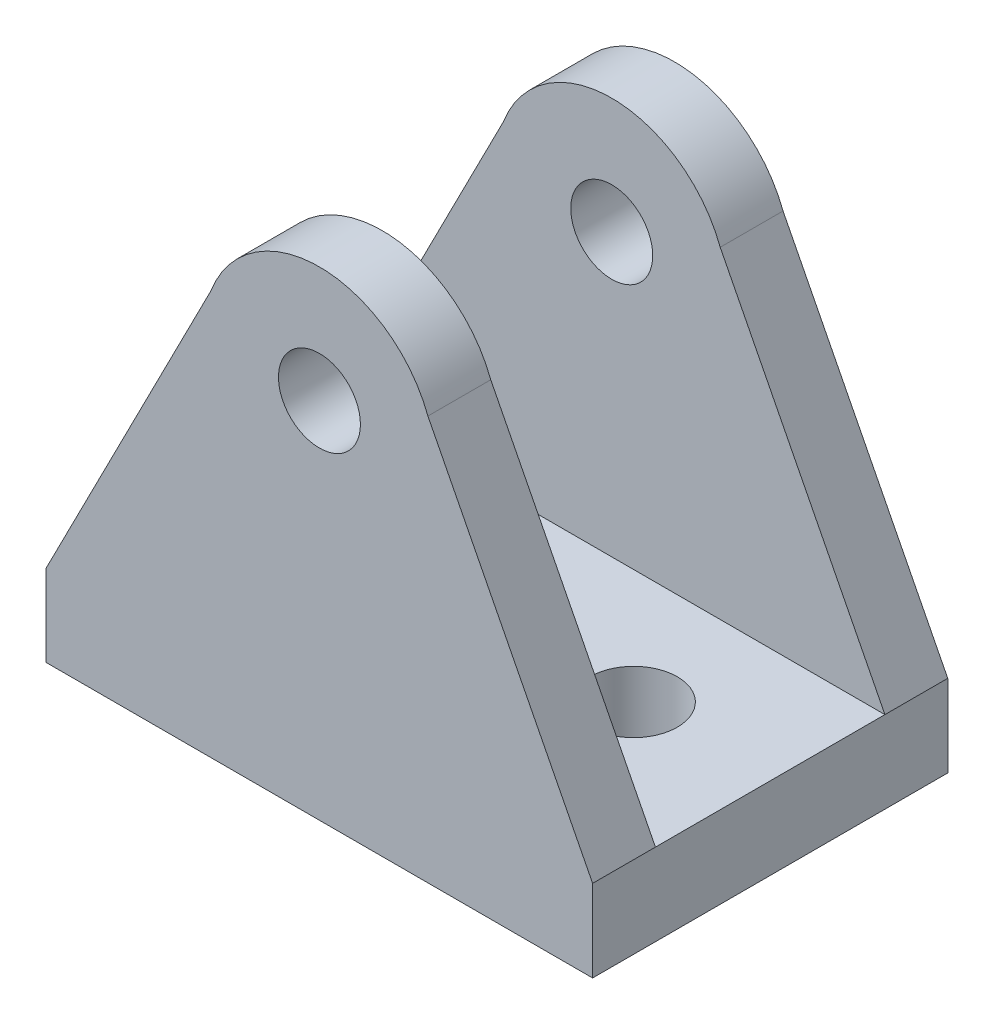
ISO-10303-21;
HEADER;
FILE_DESCRIPTION(('STEP AP214'),'2;1');
FILE_NAME('part.step','',(''),(''),'','','');
FILE_SCHEMA(('AUTOMOTIVE_DESIGN { 1 0 10303 214 1 1 1 1 }'));
ENDSEC;
DATA;
#1=APPLICATION_CONTEXT('core data for automotive mechanical design processes');
#2=APPLICATION_PROTOCOL_DEFINITION('international standard','automotive_design',2000,#1);
#3=PRODUCT_CONTEXT('',#1,'mechanical');
#4=PRODUCT('Part','Part','',(#3));
#5=PRODUCT_RELATED_PRODUCT_CATEGORY('part','',(#4));
#6=PRODUCT_DEFINITION_FORMATION('','',#4);
#7=PRODUCT_DEFINITION_CONTEXT('part definition',#1,'design');
#8=PRODUCT_DEFINITION('design','',#6,#7);
#9=PRODUCT_DEFINITION_SHAPE('','',#8);
#10=(LENGTH_UNIT() NAMED_UNIT(*) SI_UNIT(.MILLI.,.METRE.));
#11=(NAMED_UNIT(*) PLANE_ANGLE_UNIT() SI_UNIT($,.RADIAN.));
#12=(NAMED_UNIT(*) SI_UNIT($,.STERADIAN.) SOLID_ANGLE_UNIT());
#13=UNCERTAINTY_MEASURE_WITH_UNIT(LENGTH_MEASURE(1.E-05),#10,'distance_accuracy_value','');
#14=(GEOMETRIC_REPRESENTATION_CONTEXT(3) GLOBAL_UNCERTAINTY_ASSIGNED_CONTEXT((#13)) GLOBAL_UNIT_ASSIGNED_CONTEXT((#10,
#11,#12)) REPRESENTATION_CONTEXT('',''));
#15=CARTESIAN_POINT('',(0.,0.,0.));
#16=DIRECTION('',(0.,0.,1.));
#17=DIRECTION('',(1.,0.,0.));
#18=AXIS2_PLACEMENT_3D('',#15,#16,#17);
#19=CARTESIAN_POINT('',(0.,3.,0.));
#20=DIRECTION('',(0.,-1.,0.));
#21=DIRECTION('',(0.,0.,-1.));
#22=AXIS2_PLACEMENT_3D('',#19,#20,#21);
#23=PLANE('',#22);
#24=CARTESIAN_POINT('',(40.3430756374337,3.,-47.7194258680598));
#25=DIRECTION('',(0.,-1.,0.));
#26=DIRECTION('',(0.,0.,-1.));
#27=AXIS2_PLACEMENT_3D('',#24,#25,#26);
#28=CIRCLE('',#27,1.59999999999981);
#29=CARTESIAN_POINT('',(40.3430756374337,3.,-49.3194258680596));
#30=VERTEX_POINT('',#29);
#31=EDGE_CURVE('E285',#30,#30,#28,.T.);
#32=ORIENTED_EDGE('',*,*,#31,.T.);
#33=EDGE_LOOP('',(#32));
#34=FACE_BOUND('',#33,.T.);
#35=CARTESIAN_POINT('',(30.3430756374334,3.,-47.7194258680598));
#36=DIRECTION('',(0.,-1.,0.));
#37=DIRECTION('',(0.,0.,-1.));
#38=AXIS2_PLACEMENT_3D('',#35,#36,#37);
#39=CIRCLE('',#38,1.59999999999981);
#40=CARTESIAN_POINT('',(30.3430756374334,3.,-49.3194258680596));
#41=VERTEX_POINT('',#40);
#42=EDGE_CURVE('E274',#41,#41,#39,.T.);
#43=ORIENTED_EDGE('',*,*,#42,.T.);
#44=EDGE_LOOP('',(#43));
#45=FACE_BOUND('',#44,.T.);
#46=DIRECTION('',(1.,0.,0.));
#47=VECTOR('',#46,1.);
#48=CARTESIAN_POINT('',(0.,3.,-51.9194258680596));
#49=LINE('',#48,#47);
#50=CARTESIAN_POINT('',(25.3430756374335,3.,-51.9194258680596));
#51=VERTEX_POINT('',#50);
#52=CARTESIAN_POINT('',(45.3430756374336,3.,-51.9194258680596));
#53=VERTEX_POINT('',#52);
#54=EDGE_CURVE('E64',#51,#53,#49,.T.);
#55=ORIENTED_EDGE('',*,*,#54,.F.);
#56=DIRECTION('',(0.,0.,-1.));
#57=VECTOR('',#56,1.);
#58=CARTESIAN_POINT('',(25.3430756374335,3.,-51.2194258680596));
#59=LINE('',#58,#57);
#60=CARTESIAN_POINT('',(25.3430756374335,3.,-43.5194258680597));
#61=VERTEX_POINT('',#60);
#62=EDGE_CURVE('E146',#51,#61,#59,.F.);
#63=ORIENTED_EDGE('',*,*,#62,.T.);
#64=DIRECTION('',(1.,0.,0.));
#65=VECTOR('',#64,1.);
#66=CARTESIAN_POINT('',(0.,3.,-43.5194258680597));
#67=LINE('',#66,#65);
#68=CARTESIAN_POINT('',(45.3430756374336,3.,-43.5194258680597));
#69=VERTEX_POINT('',#68);
#70=EDGE_CURVE('E50',#69,#61,#67,.F.);
#71=ORIENTED_EDGE('',*,*,#70,.F.);
#72=DIRECTION('',(0.,0.,1.));
#73=VECTOR('',#72,1.);
#74=CARTESIAN_POINT('',(45.3430756374336,3.,-51.2194258680596));
#75=LINE('',#74,#73);
#76=EDGE_CURVE('E242',#69,#53,#75,.F.);
#77=ORIENTED_EDGE('',*,*,#76,.T.);
#78=EDGE_LOOP('',(#55,#63,#71,#77));
#79=FACE_BOUND('',#78,.T.);
#80=ADVANCED_FACE('F47',(#34,#45,#79),#23,.F.);
#81=CARTESIAN_POINT('',(45.3430756374336,3.,-51.2194258680596));
#82=DIRECTION('',(-1.,0.,0.));
#83=DIRECTION('',(0.,0.,1.));
#84=AXIS2_PLACEMENT_3D('',#81,#82,#83);
#85=PLANE('',#84);
#86=ORIENTED_EDGE('',*,*,#76,.F.);
#87=DIRECTION('',(0.,0.,-1.));
#88=VECTOR('',#87,1.);
#89=CARTESIAN_POINT('',(45.3430756374336,3.,-41.2194258680597));
#90=LINE('',#89,#88);
#91=CARTESIAN_POINT('',(45.3430756374336,3.,-41.2194258680597));
#92=VERTEX_POINT('',#91);
#93=EDGE_CURVE('E183',#92,#69,#90,.T.);
#94=ORIENTED_EDGE('',*,*,#93,.F.);
#95=DIRECTION('',(0.,1.,0.));
#96=VECTOR('',#95,1.);
#97=CARTESIAN_POINT('',(45.3430756374336,3.,-41.2194258680597));
#98=LINE('',#97,#96);
#99=CARTESIAN_POINT('',(45.3430756374336,0.,-41.2194258680597));
#100=VERTEX_POINT('',#99);
#101=EDGE_CURVE('E156',#100,#92,#98,.T.);
#102=ORIENTED_EDGE('',*,*,#101,.F.);
#103=DIRECTION('',(0.,0.,-1.));
#104=VECTOR('',#103,1.);
#105=CARTESIAN_POINT('',(45.3430756374336,0.,0.));
#106=LINE('',#105,#104);
#107=CARTESIAN_POINT('',(45.3430756374336,0.,-54.2194258680596));
#108=VERTEX_POINT('',#107);
#109=EDGE_CURVE('E56',#108,#100,#106,.F.);
#110=ORIENTED_EDGE('',*,*,#109,.F.);
#111=DIRECTION('',(0.,-1.,0.));
#112=VECTOR('',#111,1.);
#113=CARTESIAN_POINT('',(45.3430756374336,0.,-54.2194258680596));
#114=LINE('',#113,#112);
#115=CARTESIAN_POINT('',(45.3430756374336,3.,-54.2194258680596));
#116=VERTEX_POINT('',#115);
#117=EDGE_CURVE('E269',#116,#108,#114,.T.);
#118=ORIENTED_EDGE('',*,*,#117,.F.);
#119=DIRECTION('',(0.,0.,1.));
#120=VECTOR('',#119,1.);
#121=CARTESIAN_POINT('',(45.3430756374336,3.,-54.2194258680596));
#122=LINE('',#121,#120);
#123=EDGE_CURVE('E263',#116,#53,#122,.T.);
#124=ORIENTED_EDGE('',*,*,#123,.T.);
#125=EDGE_LOOP('',(#86,#94,#102,#110,#118,#124));
#126=FACE_BOUND('',#125,.T.);
#127=ADVANCED_FACE('F268',(#126),#85,.F.);
#128=CARTESIAN_POINT('',(25.3430756374335,3.,-51.2194258680596));
#129=DIRECTION('',(1.,0.,0.));
#130=DIRECTION('',(0.,0.,-1.));
#131=AXIS2_PLACEMENT_3D('',#128,#129,#130);
#132=PLANE('',#131);
#133=DIRECTION('',(0.,0.,-1.));
#134=VECTOR('',#133,1.);
#135=CARTESIAN_POINT('',(25.3430756374335,0.,0.));
#136=LINE('',#135,#134);
#137=CARTESIAN_POINT('',(25.3430756374335,0.,-41.2194258680597));
#138=VERTEX_POINT('',#137);
#139=CARTESIAN_POINT('',(25.3430756374335,0.,-54.2194258680596));
#140=VERTEX_POINT('',#139);
#141=EDGE_CURVE('E12',#138,#140,#136,.T.);
#142=ORIENTED_EDGE('',*,*,#141,.F.);
#143=DIRECTION('',(0.,-1.,0.));
#144=VECTOR('',#143,1.);
#145=CARTESIAN_POINT('',(25.3430756374335,0.,-41.2194258680597));
#146=LINE('',#145,#144);
#147=CARTESIAN_POINT('',(25.3430756374335,3.,-41.2194258680597));
#148=VERTEX_POINT('',#147);
#149=EDGE_CURVE('E166',#148,#138,#146,.T.);
#150=ORIENTED_EDGE('',*,*,#149,.F.);
#151=DIRECTION('',(0.,0.,-1.));
#152=VECTOR('',#151,1.);
#153=CARTESIAN_POINT('',(25.3430756374335,3.,-41.2194258680597));
#154=LINE('',#153,#152);
#155=EDGE_CURVE('E171',#148,#61,#154,.T.);
#156=ORIENTED_EDGE('',*,*,#155,.T.);
#157=ORIENTED_EDGE('',*,*,#62,.F.);
#158=DIRECTION('',(0.,0.,1.));
#159=VECTOR('',#158,1.);
#160=CARTESIAN_POINT('',(25.3430756374335,3.,-54.2194258680596));
#161=LINE('',#160,#159);
#162=CARTESIAN_POINT('',(25.3430756374335,3.,-54.2194258680596));
#163=VERTEX_POINT('',#162);
#164=EDGE_CURVE('E127',#163,#51,#161,.T.);
#165=ORIENTED_EDGE('',*,*,#164,.F.);
#166=DIRECTION('',(0.,1.,0.));
#167=VECTOR('',#166,1.);
#168=CARTESIAN_POINT('',(25.3430756374335,3.,-54.2194258680596));
#169=LINE('',#168,#167);
#170=EDGE_CURVE('E133',#140,#163,#169,.T.);
#171=ORIENTED_EDGE('',*,*,#170,.F.);
#172=EDGE_LOOP('',(#142,#150,#156,#157,#165,#171));
#173=FACE_BOUND('',#172,.T.);
#174=ADVANCED_FACE('F144',(#173),#132,.F.);
#175=CARTESIAN_POINT('',(0.,0.,0.));
#176=DIRECTION('',(0.,-1.,0.));
#177=DIRECTION('',(0.,0.,-1.));
#178=AXIS2_PLACEMENT_3D('',#175,#176,#177);
#179=PLANE('',#178);
#180=CARTESIAN_POINT('',(40.3430756374337,0.,-47.7194258680598));
#181=DIRECTION('',(0.,-1.,0.));
#182=DIRECTION('',(0.,0.,-1.));
#183=AXIS2_PLACEMENT_3D('',#180,#181,#182);
#184=CIRCLE('',#183,1.59999999999981);
#185=CARTESIAN_POINT('',(40.3430756374337,0.,-49.3194258680596));
#186=VERTEX_POINT('',#185);
#187=EDGE_CURVE('E288',#186,#186,#184,.T.);
#188=ORIENTED_EDGE('',*,*,#187,.F.);
#189=EDGE_LOOP('',(#188));
#190=FACE_BOUND('',#189,.T.);
#191=CARTESIAN_POINT('',(30.3430756374334,0.,-47.7194258680598));
#192=DIRECTION('',(0.,-1.,0.));
#193=DIRECTION('',(0.,0.,-1.));
#194=AXIS2_PLACEMENT_3D('',#191,#192,#193);
#195=CIRCLE('',#194,1.59999999999981);
#196=CARTESIAN_POINT('',(30.3430756374334,0.,-49.3194258680596));
#197=VERTEX_POINT('',#196);
#198=EDGE_CURVE('E282',#197,#197,#195,.T.);
#199=ORIENTED_EDGE('',*,*,#198,.F.);
#200=EDGE_LOOP('',(#199));
#201=FACE_BOUND('',#200,.T.);
#202=ORIENTED_EDGE('',*,*,#109,.T.);
#203=DIRECTION('',(1.,0.,0.));
#204=VECTOR('',#203,1.);
#205=CARTESIAN_POINT('',(45.3430756374336,0.,-41.2194258680597));
#206=LINE('',#205,#204);
#207=EDGE_CURVE('E169',#138,#100,#206,.T.);
#208=ORIENTED_EDGE('',*,*,#207,.F.);
#209=ORIENTED_EDGE('',*,*,#141,.T.);
#210=DIRECTION('',(-1.,0.,0.));
#211=VECTOR('',#210,1.);
#212=CARTESIAN_POINT('',(25.3430756374335,0.,-54.2194258680596));
#213=LINE('',#212,#211);
#214=EDGE_CURVE('E140',#108,#140,#213,.T.);
#215=ORIENTED_EDGE('',*,*,#214,.F.);
#216=EDGE_LOOP('',(#202,#208,#209,#215));
#217=FACE_BOUND('',#216,.T.);
#218=ADVANCED_FACE('F328',(#190,#201,#217),#179,.T.);
#219=CARTESIAN_POINT('',(39.3139725530418,14.8000000000001,-41.2194258680597));
#220=DIRECTION('',(-0.890496084069209,-0.45499090568648,0.));
#221=DIRECTION('',(0.45499090568648,-0.890496084069209,0.));
#222=AXIS2_PLACEMENT_3D('',#219,#220,#221);
#223=PLANE('',#222);
#224=DIRECTION('',(-0.45499090568648,0.890496084069209,0.));
#225=VECTOR('',#224,1.);
#226=CARTESIAN_POINT('',(39.3139725530418,14.8000000000001,-43.5194258680597));
#227=LINE('',#226,#225);
#228=CARTESIAN_POINT('',(39.3139725530418,14.8000000000001,-43.5194258680597));
#229=VERTEX_POINT('',#228);
#230=EDGE_CURVE('E148',#69,#229,#227,.T.);
#231=ORIENTED_EDGE('',*,*,#230,.T.);
#232=DIRECTION('',(0.,0.,-1.));
#233=VECTOR('',#232,1.);
#234=CARTESIAN_POINT('',(39.3139725530418,14.8000000000001,-41.2194258680597));
#235=LINE('',#234,#233);
#236=CARTESIAN_POINT('',(39.3139725530418,14.8000000000001,-41.2194258680597));
#237=VERTEX_POINT('',#236);
#238=EDGE_CURVE('E180',#237,#229,#235,.T.);
#239=ORIENTED_EDGE('',*,*,#238,.F.);
#240=DIRECTION('',(-0.45499090568648,0.890496084069209,0.));
#241=VECTOR('',#240,1.);
#242=CARTESIAN_POINT('',(39.3139725530418,14.8000000000001,-41.2194258680597));
#243=LINE('',#242,#241);
#244=EDGE_CURVE('E159',#92,#237,#243,.T.);
#245=ORIENTED_EDGE('',*,*,#244,.F.);
#246=ORIENTED_EDGE('',*,*,#93,.T.);
#247=EDGE_LOOP('',(#231,#239,#245,#246));
#248=FACE_BOUND('',#247,.T.);
#249=ADVANCED_FACE('F316',(#248),#223,.F.);
#250=CARTESIAN_POINT('',(35.3430756374336,13.3,-41.2194258680597));
#251=DIRECTION('',(0.,0.,-1.));
#252=DIRECTION('',(-1.,0.,0.));
#253=AXIS2_PLACEMENT_3D('',#250,#251,#252);
#254=CYLINDRICAL_SURFACE('',#253,4.24476410585876);
#255=CARTESIAN_POINT('',(35.3430756374336,13.3,-43.5194258680597));
#256=DIRECTION('',(0.,0.,1.));
#257=DIRECTION('',(-1.,0.,0.));
#258=AXIS2_PLACEMENT_3D('',#255,#256,#257);
#259=CIRCLE('',#258,4.24476410585876);
#260=CARTESIAN_POINT('',(31.3721787218253,14.8000000000001,-43.5194258680597));
#261=VERTEX_POINT('',#260);
#262=EDGE_CURVE('E150',#229,#261,#259,.T.);
#263=ORIENTED_EDGE('',*,*,#262,.T.);
#264=DIRECTION('',(0.,0.,-1.));
#265=VECTOR('',#264,1.);
#266=CARTESIAN_POINT('',(31.3721787218253,14.8000000000001,-41.2194258680597));
#267=LINE('',#266,#265);
#268=CARTESIAN_POINT('',(31.3721787218253,14.8000000000001,-41.2194258680597));
#269=VERTEX_POINT('',#268);
#270=EDGE_CURVE('E177',#269,#261,#267,.T.);
#271=ORIENTED_EDGE('',*,*,#270,.F.);
#272=CARTESIAN_POINT('',(35.3430756374336,13.3,-41.2194258680597));
#273=DIRECTION('',(0.,0.,1.));
#274=DIRECTION('',(-1.,0.,0.));
#275=AXIS2_PLACEMENT_3D('',#272,#273,#274);
#276=CIRCLE('',#275,4.24476410585876);
#277=EDGE_CURVE('E162',#237,#269,#276,.T.);
#278=ORIENTED_EDGE('',*,*,#277,.F.);
#279=ORIENTED_EDGE('',*,*,#238,.T.);
#280=EDGE_LOOP('',(#263,#271,#278,#279));
#281=FACE_BOUND('',#280,.T.);
#282=ADVANCED_FACE('F321',(#281),#254,.T.);
#283=CARTESIAN_POINT('',(25.3430756374335,3.,-41.2194258680597));
#284=DIRECTION('',(0.890496084069209,-0.454990905686481,0.));
#285=DIRECTION('',(0.454990905686481,0.890496084069209,0.));
#286=AXIS2_PLACEMENT_3D('',#283,#284,#285);
#287=PLANE('',#286);
#288=DIRECTION('',(-0.454990905686481,-0.890496084069209,0.));
#289=VECTOR('',#288,1.);
#290=CARTESIAN_POINT('',(25.3430756374335,3.,-43.5194258680597));
#291=LINE('',#290,#289);
#292=EDGE_CURVE('E160',#261,#61,#291,.T.);
#293=ORIENTED_EDGE('',*,*,#292,.T.);
#294=ORIENTED_EDGE('',*,*,#155,.F.);
#295=DIRECTION('',(-0.454990905686481,-0.890496084069209,0.));
#296=VECTOR('',#295,1.);
#297=CARTESIAN_POINT('',(25.3430756374335,3.,-41.2194258680597));
#298=LINE('',#297,#296);
#299=EDGE_CURVE('E164',#269,#148,#298,.T.);
#300=ORIENTED_EDGE('',*,*,#299,.F.);
#301=ORIENTED_EDGE('',*,*,#270,.T.);
#302=EDGE_LOOP('',(#293,#294,#300,#301));
#303=FACE_BOUND('',#302,.T.);
#304=ADVANCED_FACE('F310',(#303),#287,.F.);
#305=CARTESIAN_POINT('',(35.3430756374336,13.3,-41.2194258680597));
#306=DIRECTION('',(0.,0.,-1.));
#307=DIRECTION('',(-1.,0.,0.));
#308=AXIS2_PLACEMENT_3D('',#305,#306,#307);
#309=PLANE('',#308);
#310=CARTESIAN_POINT('',(35.3430756374336,13.3,-41.2194258680597));
#311=DIRECTION('',(0.,0.,1.));
#312=DIRECTION('',(1.,0.,0.));
#313=AXIS2_PLACEMENT_3D('',#310,#311,#312);
#314=CIRCLE('',#313,1.50000000000004);
#315=CARTESIAN_POINT('',(36.8430756374336,13.3,-41.2194258680597));
#316=VERTEX_POINT('',#315);
#317=EDGE_CURVE('E300',#316,#316,#314,.T.);
#318=ORIENTED_EDGE('',*,*,#317,.F.);
#319=EDGE_LOOP('',(#318));
#320=FACE_BOUND('',#319,.T.);
#321=ORIENTED_EDGE('',*,*,#101,.T.);
#322=ORIENTED_EDGE('',*,*,#244,.T.);
#323=ORIENTED_EDGE('',*,*,#277,.T.);
#324=ORIENTED_EDGE('',*,*,#299,.T.);
#325=ORIENTED_EDGE('',*,*,#149,.T.);
#326=ORIENTED_EDGE('',*,*,#207,.T.);
#327=EDGE_LOOP('',(#321,#322,#323,#324,#325,#326));
#328=FACE_BOUND('',#327,.T.);
#329=ADVANCED_FACE('F306',(#320,#328),#309,.F.);
#330=CARTESIAN_POINT('',(35.3430756374336,13.3,-43.5194258680597));
#331=DIRECTION('',(0.,0.,-1.));
#332=DIRECTION('',(-1.,0.,0.));
#333=AXIS2_PLACEMENT_3D('',#330,#331,#332);
#334=PLANE('',#333);
#335=CARTESIAN_POINT('',(35.3430756374336,13.3,-43.5194258680597));
#336=DIRECTION('',(0.,0.,-1.));
#337=DIRECTION('',(-1.,0.,0.));
#338=AXIS2_PLACEMENT_3D('',#335,#336,#337);
#339=CIRCLE('',#338,1.50000000000004);
#340=CARTESIAN_POINT('',(33.8430756374335,13.3,-43.5194258680597));
#341=VERTEX_POINT('',#340);
#342=EDGE_CURVE('E297',#341,#341,#339,.T.);
#343=ORIENTED_EDGE('',*,*,#342,.F.);
#344=EDGE_LOOP('',(#343));
#345=FACE_BOUND('',#344,.T.);
#346=ORIENTED_EDGE('',*,*,#230,.F.);
#347=ORIENTED_EDGE('',*,*,#70,.T.);
#348=ORIENTED_EDGE('',*,*,#292,.F.);
#349=ORIENTED_EDGE('',*,*,#262,.F.);
#350=EDGE_LOOP('',(#346,#347,#348,#349));
#351=FACE_BOUND('',#350,.T.);
#352=ADVANCED_FACE('F309',(#345,#351),#334,.T.);
#353=CARTESIAN_POINT('',(31.3721722439155,14.8000053075813,-54.2194258680596));
#354=DIRECTION('',(0.890496365058051,-0.454990355742182,0.));
#355=DIRECTION('',(0.454990355742182,0.890496365058052,0.));
#356=AXIS2_PLACEMENT_3D('',#353,#354,#355);
#357=PLANE('',#356);
#358=DIRECTION('',(0.454990355742182,0.890496365058051,0.));
#359=VECTOR('',#358,1.);
#360=CARTESIAN_POINT('',(31.3721722439155,14.8000053075813,-51.9194258680596));
#361=LINE('',#360,#359);
#362=CARTESIAN_POINT('',(31.3721722439155,14.8000053075813,-51.9194258680596));
#363=VERTEX_POINT('',#362);
#364=EDGE_CURVE('E257',#51,#363,#361,.T.);
#365=ORIENTED_EDGE('',*,*,#364,.T.);
#366=DIRECTION('',(0.,0.,1.));
#367=VECTOR('',#366,1.);
#368=CARTESIAN_POINT('',(31.3721722439155,14.8000053075813,-54.2194258680596));
#369=LINE('',#368,#367);
#370=CARTESIAN_POINT('',(31.3721722439155,14.8000053075813,-54.2194258680596));
#371=VERTEX_POINT('',#370);
#372=EDGE_CURVE('E129',#371,#363,#369,.T.);
#373=ORIENTED_EDGE('',*,*,#372,.F.);
#374=DIRECTION('',(0.454990355742182,0.890496365058051,0.));
#375=VECTOR('',#374,1.);
#376=CARTESIAN_POINT('',(31.3721722439155,14.8000053075813,-54.2194258680596));
#377=LINE('',#376,#375);
#378=EDGE_CURVE('E123',#163,#371,#377,.T.);
#379=ORIENTED_EDGE('',*,*,#378,.F.);
#380=ORIENTED_EDGE('',*,*,#164,.T.);
#381=EDGE_LOOP('',(#365,#373,#379,#380));
#382=FACE_BOUND('',#381,.T.);
#383=ADVANCED_FACE('F125',(#382),#357,.F.);
#384=CARTESIAN_POINT('',(35.3430691595237,13.3000053075812,-54.2194258680596));
#385=DIRECTION('',(0.,0.,1.));
#386=DIRECTION('',(1.,0.,0.));
#387=AXIS2_PLACEMENT_3D('',#384,#385,#386);
#388=CYLINDRICAL_SURFACE('',#387,4.24476410585876);
#389=CARTESIAN_POINT('',(35.3430691595237,13.3000053075812,-51.9194258680596));
#390=DIRECTION('',(0.,0.,-1.));
#391=DIRECTION('',(1.,0.,0.));
#392=AXIS2_PLACEMENT_3D('',#389,#390,#391);
#393=CIRCLE('',#392,4.24476410585876);
#394=CARTESIAN_POINT('',(39.3139660751319,14.8000053075813,-51.9194258680596));
#395=VERTEX_POINT('',#394);
#396=EDGE_CURVE('E266',#363,#395,#393,.T.);
#397=ORIENTED_EDGE('',*,*,#396,.T.);
#398=DIRECTION('',(0.,0.,1.));
#399=VECTOR('',#398,1.);
#400=CARTESIAN_POINT('',(39.3139660751319,14.8000053075813,-54.2194258680596));
#401=LINE('',#400,#399);
#402=CARTESIAN_POINT('',(39.3139660751319,14.8000053075813,-54.2194258680596));
#403=VERTEX_POINT('',#402);
#404=EDGE_CURVE('E152',#403,#395,#401,.T.);
#405=ORIENTED_EDGE('',*,*,#404,.F.);
#406=CARTESIAN_POINT('',(35.3430691595237,13.3000053075812,-54.2194258680596));
#407=DIRECTION('',(0.,0.,-1.));
#408=DIRECTION('',(1.,0.,0.));
#409=AXIS2_PLACEMENT_3D('',#406,#407,#408);
#410=CIRCLE('',#409,4.24476410585876);
#411=EDGE_CURVE('E132',#371,#403,#410,.T.);
#412=ORIENTED_EDGE('',*,*,#411,.F.);
#413=ORIENTED_EDGE('',*,*,#372,.T.);
#414=EDGE_LOOP('',(#397,#405,#412,#413));
#415=FACE_BOUND('',#414,.T.);
#416=ADVANCED_FACE('F455',(#415),#388,.T.);
#417=CARTESIAN_POINT('',(45.3430756374336,3.,-54.2194258680596));
#418=DIRECTION('',(-0.890495968917446,-0.454991131058374,0.));
#419=DIRECTION('',(0.454991131058375,-0.890495968917446,0.));
#420=AXIS2_PLACEMENT_3D('',#417,#418,#419);
#421=PLANE('',#420);
#422=DIRECTION('',(0.454991131058375,-0.890495968917446,0.));
#423=VECTOR('',#422,1.);
#424=CARTESIAN_POINT('',(45.3430756374336,3.,-51.9194258680596));
#425=LINE('',#424,#423);
#426=EDGE_CURVE('E142',#395,#53,#425,.T.);
#427=ORIENTED_EDGE('',*,*,#426,.T.);
#428=ORIENTED_EDGE('',*,*,#123,.F.);
#429=DIRECTION('',(0.454991131058375,-0.890495968917446,0.));
#430=VECTOR('',#429,1.);
#431=CARTESIAN_POINT('',(45.3430756374336,3.,-54.2194258680596));
#432=LINE('',#431,#430);
#433=EDGE_CURVE('E277',#403,#116,#432,.T.);
#434=ORIENTED_EDGE('',*,*,#433,.F.);
#435=ORIENTED_EDGE('',*,*,#404,.T.);
#436=EDGE_LOOP('',(#427,#428,#434,#435));
#437=FACE_BOUND('',#436,.T.);
#438=ADVANCED_FACE('F261',(#437),#421,.F.);
#439=CARTESIAN_POINT('',(35.3430691595237,13.3000053075812,-54.2194258680596));
#440=DIRECTION('',(0.,0.,1.));
#441=DIRECTION('',(1.,0.,0.));
#442=AXIS2_PLACEMENT_3D('',#439,#440,#441);
#443=PLANE('',#442);
#444=CARTESIAN_POINT('',(35.3430691595237,13.3000053075812,-54.2194258680596));
#445=DIRECTION('',(0.,0.,-1.));
#446=DIRECTION('',(-1.,0.,0.));
#447=AXIS2_PLACEMENT_3D('',#444,#445,#446);
#448=CIRCLE('',#447,1.50000000000004);
#449=CARTESIAN_POINT('',(33.8430691595237,13.3000053075812,-54.2194258680596));
#450=VERTEX_POINT('',#449);
#451=EDGE_CURVE('E294',#450,#450,#448,.T.);
#452=ORIENTED_EDGE('',*,*,#451,.F.);
#453=EDGE_LOOP('',(#452));
#454=FACE_BOUND('',#453,.T.);
#455=ORIENTED_EDGE('',*,*,#170,.T.);
#456=ORIENTED_EDGE('',*,*,#378,.T.);
#457=ORIENTED_EDGE('',*,*,#411,.T.);
#458=ORIENTED_EDGE('',*,*,#433,.T.);
#459=ORIENTED_EDGE('',*,*,#117,.T.);
#460=ORIENTED_EDGE('',*,*,#214,.T.);
#461=EDGE_LOOP('',(#455,#456,#457,#458,#459,#460));
#462=FACE_BOUND('',#461,.T.);
#463=ADVANCED_FACE('F137',(#454,#462),#443,.F.);
#464=CARTESIAN_POINT('',(35.3430691595237,13.3000053075812,-51.9194258680596));
#465=DIRECTION('',(0.,0.,1.));
#466=DIRECTION('',(1.,0.,0.));
#467=AXIS2_PLACEMENT_3D('',#464,#465,#466);
#468=PLANE('',#467);
#469=CARTESIAN_POINT('',(35.3430691595237,13.3000053075812,-51.9194258680596));
#470=DIRECTION('',(0.,0.,1.));
#471=DIRECTION('',(1.,0.,0.));
#472=AXIS2_PLACEMENT_3D('',#469,#470,#471);
#473=CIRCLE('',#472,1.50000000000005);
#474=CARTESIAN_POINT('',(36.8430691595238,13.3000053075812,-51.9194258680596));
#475=VERTEX_POINT('',#474);
#476=EDGE_CURVE('E291',#475,#475,#473,.T.);
#477=ORIENTED_EDGE('',*,*,#476,.F.);
#478=EDGE_LOOP('',(#477));
#479=FACE_BOUND('',#478,.T.);
#480=ORIENTED_EDGE('',*,*,#364,.F.);
#481=ORIENTED_EDGE('',*,*,#54,.T.);
#482=ORIENTED_EDGE('',*,*,#426,.F.);
#483=ORIENTED_EDGE('',*,*,#396,.F.);
#484=EDGE_LOOP('',(#480,#481,#482,#483));
#485=FACE_BOUND('',#484,.T.);
#486=ADVANCED_FACE('F255',(#479,#485),#468,.T.);
#487=CARTESIAN_POINT('',(30.3430756374334,0.,-47.7194258680598));
#488=DIRECTION('',(0.,-1.,0.));
#489=DIRECTION('',(0.,0.,-1.));
#490=AXIS2_PLACEMENT_3D('',#487,#488,#489);
#491=CYLINDRICAL_SURFACE('',#490,1.59999999999981);
#492=ORIENTED_EDGE('',*,*,#198,.T.);
#493=EDGE_LOOP('',(#492));
#494=FACE_BOUND('',#493,.T.);
#495=ORIENTED_EDGE('',*,*,#42,.F.);
#496=EDGE_LOOP('',(#495));
#497=FACE_BOUND('',#496,.T.);
#498=ADVANCED_FACE('F483',(#494,#497),#491,.F.);
#499=CARTESIAN_POINT('',(40.3430756374337,0.,-47.7194258680598));
#500=DIRECTION('',(0.,-1.,0.));
#501=DIRECTION('',(0.,0.,-1.));
#502=AXIS2_PLACEMENT_3D('',#499,#500,#501);
#503=CYLINDRICAL_SURFACE('',#502,1.59999999999981);
#504=ORIENTED_EDGE('',*,*,#187,.T.);
#505=EDGE_LOOP('',(#504));
#506=FACE_BOUND('',#505,.T.);
#507=ORIENTED_EDGE('',*,*,#31,.F.);
#508=EDGE_LOOP('',(#507));
#509=FACE_BOUND('',#508,.T.);
#510=ADVANCED_FACE('F488',(#506,#509),#503,.F.);
#511=CARTESIAN_POINT('',(35.3430691595237,13.3000053075812,-54.2194258680596));
#512=DIRECTION('',(0.,0.,-1.));
#513=DIRECTION('',(-1.,0.,0.));
#514=AXIS2_PLACEMENT_3D('',#511,#512,#513);
#515=CYLINDRICAL_SURFACE('',#514,1.50000000000005);
#516=ORIENTED_EDGE('',*,*,#451,.T.);
#517=EDGE_LOOP('',(#516));
#518=FACE_BOUND('',#517,.T.);
#519=ORIENTED_EDGE('',*,*,#476,.T.);
#520=EDGE_LOOP('',(#519));
#521=FACE_BOUND('',#520,.T.);
#522=ADVANCED_FACE('F500',(#518,#521),#515,.F.);
#523=CARTESIAN_POINT('',(35.3430756374336,13.3,-41.2194258680597));
#524=DIRECTION('',(0.,0.,1.));
#525=DIRECTION('',(1.,0.,0.));
#526=AXIS2_PLACEMENT_3D('',#523,#524,#525);
#527=CYLINDRICAL_SURFACE('',#526,1.50000000000004);
#528=ORIENTED_EDGE('',*,*,#342,.T.);
#529=EDGE_LOOP('',(#528));
#530=FACE_BOUND('',#529,.T.);
#531=ORIENTED_EDGE('',*,*,#317,.T.);
#532=EDGE_LOOP('',(#531));
#533=FACE_BOUND('',#532,.T.);
#534=ADVANCED_FACE('F304',(#530,#533),#527,.F.);
#535=CLOSED_SHELL('',(#80,#127,#174,#218,#249,#282,#304,#329,#352,#383,#416,#438,#463,#486,#498,
#510,#522,#534));
#536=MANIFOLD_SOLID_BREP('B2',#535);
#537=ADVANCED_BREP_SHAPE_REPRESENTATION('',(#18,#536),#14);
#538=SHAPE_DEFINITION_REPRESENTATION(#9,#537);
ENDSEC;
END-ISO-10303-21;
